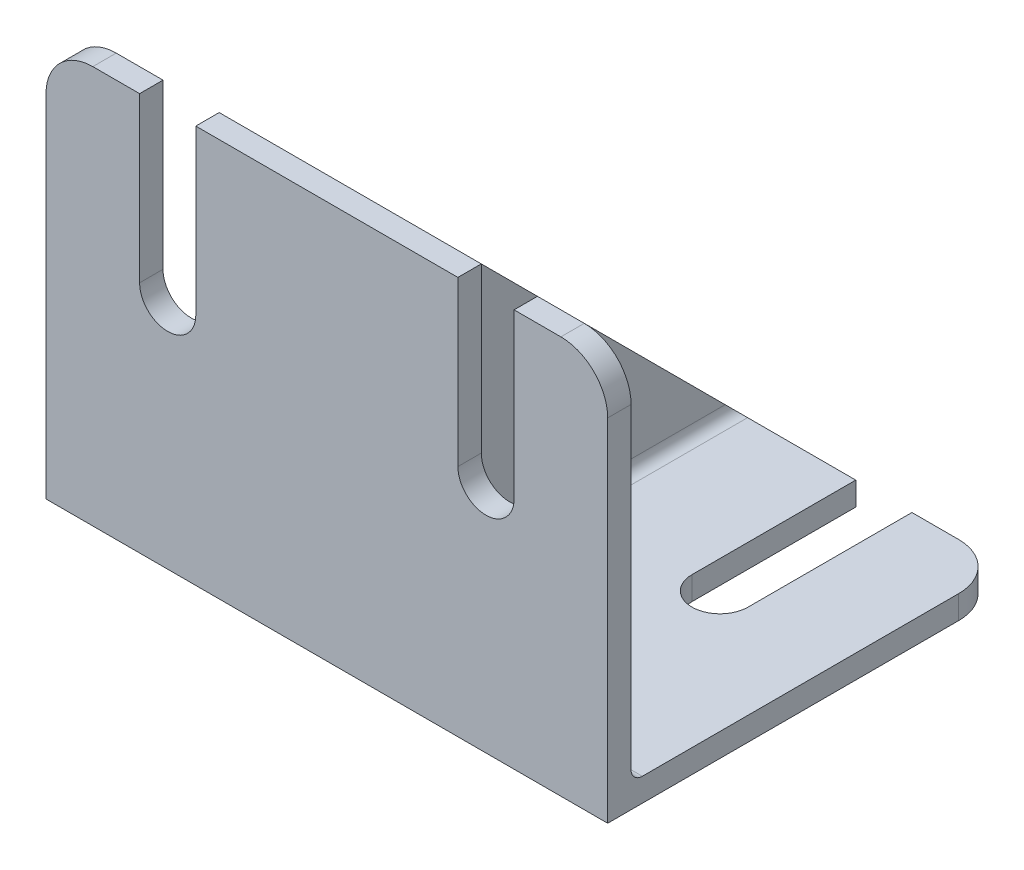
ISO-10303-21;
HEADER;
FILE_DESCRIPTION(('STEP AP214'),'2;1');
FILE_NAME('part.step','',(''),(''),'','','');
FILE_SCHEMA(('AUTOMOTIVE_DESIGN { 1 0 10303 214 1 1 1 1 }'));
ENDSEC;
DATA;
#1=APPLICATION_CONTEXT('core data for automotive mechanical design processes');
#2=APPLICATION_PROTOCOL_DEFINITION('international standard','automotive_design',2000,#1);
#3=PRODUCT_CONTEXT('',#1,'mechanical');
#4=PRODUCT('Part','Part','',(#3));
#5=PRODUCT_RELATED_PRODUCT_CATEGORY('part','',(#4));
#6=PRODUCT_DEFINITION_FORMATION('','',#4);
#7=PRODUCT_DEFINITION_CONTEXT('part definition',#1,'design');
#8=PRODUCT_DEFINITION('design','',#6,#7);
#9=PRODUCT_DEFINITION_SHAPE('','',#8);
#10=(LENGTH_UNIT() NAMED_UNIT(*) SI_UNIT(.MILLI.,.METRE.));
#11=(NAMED_UNIT(*) PLANE_ANGLE_UNIT() SI_UNIT($,.RADIAN.));
#12=(NAMED_UNIT(*) SI_UNIT($,.STERADIAN.) SOLID_ANGLE_UNIT());
#13=UNCERTAINTY_MEASURE_WITH_UNIT(LENGTH_MEASURE(1.E-05),#10,'distance_accuracy_value','');
#14=(GEOMETRIC_REPRESENTATION_CONTEXT(3) GLOBAL_UNCERTAINTY_ASSIGNED_CONTEXT((#13)) GLOBAL_UNIT_ASSIGNED_CONTEXT((#10,
#11,#12)) REPRESENTATION_CONTEXT('',''));
#15=CARTESIAN_POINT('',(0.,0.,0.));
#16=DIRECTION('',(0.,0.,1.));
#17=DIRECTION('',(1.,0.,0.));
#18=AXIS2_PLACEMENT_3D('',#15,#16,#17);
#19=CARTESIAN_POINT('',(76.2,0.,-50.8));
#20=DIRECTION('',(0.,0.,-1.));
#21=DIRECTION('',(-1.,0.,0.));
#22=AXIS2_PLACEMENT_3D('',#19,#20,#21);
#23=PLANE('',#22);
#24=DIRECTION('',(0.,-1.,0.));
#25=VECTOR('',#24,1.);
#26=CARTESIAN_POINT('',(63.5,0.,-50.8));
#27=LINE('',#26,#25);
#28=CARTESIAN_POINT('',(63.5,0.,-50.8));
#29=VERTEX_POINT('',#28);
#30=CARTESIAN_POINT('',(63.5,-3.175,-50.8));
#31=VERTEX_POINT('',#30);
#32=EDGE_CURVE('E267',#29,#31,#27,.T.);
#33=ORIENTED_EDGE('',*,*,#32,.F.);
#34=DIRECTION('',(-1.,0.,0.));
#35=VECTOR('',#34,1.);
#36=CARTESIAN_POINT('',(76.2,0.,-50.8));
#37=LINE('',#36,#35);
#38=CARTESIAN_POINT('',(69.85,0.,-50.8));
#39=VERTEX_POINT('',#38);
#40=EDGE_CURVE('E388',#39,#29,#37,.T.);
#41=ORIENTED_EDGE('',*,*,#40,.F.);
#42=DIRECTION('',(0.,-1.,0.));
#43=VECTOR('',#42,1.);
#44=CARTESIAN_POINT('',(69.85,-3.175,-50.8));
#45=LINE('',#44,#43);
#46=CARTESIAN_POINT('',(69.85,-3.175,-50.8));
#47=VERTEX_POINT('',#46);
#48=EDGE_CURVE('E442',#39,#47,#45,.T.);
#49=ORIENTED_EDGE('',*,*,#48,.T.);
#50=DIRECTION('',(-1.,0.,0.));
#51=VECTOR('',#50,1.);
#52=CARTESIAN_POINT('',(76.2,-3.175,-50.8));
#53=LINE('',#52,#51);
#54=EDGE_CURVE('E394',#47,#31,#53,.T.);
#55=ORIENTED_EDGE('',*,*,#54,.T.);
#56=EDGE_LOOP('',(#33,#41,#49,#55));
#57=FACE_BOUND('',#56,.T.);
#58=ADVANCED_FACE('F33',(#57),#23,.T.);
#59=DIRECTION('',(0.,1.,0.));
#60=VECTOR('',#59,1.);
#61=CARTESIAN_POINT('',(55.88,0.,-50.8));
#62=LINE('',#61,#60);
#63=CARTESIAN_POINT('',(55.88,-3.175,-50.8));
#64=VERTEX_POINT('',#63);
#65=CARTESIAN_POINT('',(55.88,0.,-50.8));
#66=VERTEX_POINT('',#65);
#67=EDGE_CURVE('E260',#64,#66,#62,.T.);
#68=ORIENTED_EDGE('',*,*,#67,.F.);
#69=CARTESIAN_POINT('',(20.32,-3.175,-50.8));
#70=VERTEX_POINT('',#69);
#71=EDGE_CURVE('E397',#64,#70,#53,.T.);
#72=ORIENTED_EDGE('',*,*,#71,.T.);
#73=DIRECTION('',(0.,-1.,0.));
#74=VECTOR('',#73,1.);
#75=CARTESIAN_POINT('',(20.32,0.,-50.8));
#76=LINE('',#75,#74);
#77=CARTESIAN_POINT('',(20.32,0.,-50.8));
#78=VERTEX_POINT('',#77);
#79=EDGE_CURVE('E459',#78,#70,#76,.T.);
#80=ORIENTED_EDGE('',*,*,#79,.F.);
#81=CARTESIAN_POINT('',(34.9885,0.,-50.8));
#82=VERTEX_POINT('',#81);
#83=EDGE_CURVE('E393',#82,#78,#37,.T.);
#84=ORIENTED_EDGE('',*,*,#83,.F.);
#85=DIRECTION('',(1.,0.,0.));
#86=VECTOR('',#85,1.);
#87=CARTESIAN_POINT('',(36.5125,0.,-50.8));
#88=LINE('',#87,#86);
#89=CARTESIAN_POINT('',(41.2115,0.,-50.8));
#90=VERTEX_POINT('',#89);
#91=EDGE_CURVE('E359',#82,#90,#88,.T.);
#92=ORIENTED_EDGE('',*,*,#91,.T.);
#93=EDGE_CURVE('E392',#66,#90,#37,.T.);
#94=ORIENTED_EDGE('',*,*,#93,.F.);
#95=EDGE_LOOP('',(#68,#72,#80,#84,#92,#94));
#96=FACE_BOUND('',#95,.T.);
#97=ADVANCED_FACE('F549',(#96),#23,.T.);
#98=CARTESIAN_POINT('',(76.2,50.8,3.175));
#99=DIRECTION('',(0.,1.,0.));
#100=DIRECTION('',(0.,0.,1.));
#101=AXIS2_PLACEMENT_3D('',#98,#99,#100);
#102=PLANE('',#101);
#103=DIRECTION('',(-1.,0.,0.));
#104=VECTOR('',#103,1.);
#105=CARTESIAN_POINT('',(76.2,50.8,0.));
#106=LINE('',#105,#104);
#107=CARTESIAN_POINT('',(69.85,50.8,0.));
#108=VERTEX_POINT('',#107);
#109=CARTESIAN_POINT('',(63.5,50.8,0.));
#110=VERTEX_POINT('',#109);
#111=EDGE_CURVE('E406',#108,#110,#106,.T.);
#112=ORIENTED_EDGE('',*,*,#111,.T.);
#113=DIRECTION('',(0.,0.,1.));
#114=VECTOR('',#113,1.);
#115=CARTESIAN_POINT('',(63.5,50.8,3.175));
#116=LINE('',#115,#114);
#117=CARTESIAN_POINT('',(63.5,50.8,3.175));
#118=VERTEX_POINT('',#117);
#119=EDGE_CURVE('E330',#110,#118,#116,.T.);
#120=ORIENTED_EDGE('',*,*,#119,.T.);
#121=DIRECTION('',(-1.,0.,0.));
#122=VECTOR('',#121,1.);
#123=CARTESIAN_POINT('',(76.2,50.8,3.175));
#124=LINE('',#123,#122);
#125=CARTESIAN_POINT('',(69.85,50.8,3.175));
#126=VERTEX_POINT('',#125);
#127=EDGE_CURVE('E401',#126,#118,#124,.T.);
#128=ORIENTED_EDGE('',*,*,#127,.F.);
#129=DIRECTION('',(0.,0.,-1.));
#130=VECTOR('',#129,1.);
#131=CARTESIAN_POINT('',(69.85,50.8,0.));
#132=LINE('',#131,#130);
#133=EDGE_CURVE('E423',#126,#108,#132,.T.);
#134=ORIENTED_EDGE('',*,*,#133,.T.);
#135=EDGE_LOOP('',(#112,#120,#128,#134));
#136=FACE_BOUND('',#135,.T.);
#137=ADVANCED_FACE('F628',(#136),#102,.T.);
#138=CARTESIAN_POINT('',(55.88,50.8,3.175));
#139=VERTEX_POINT('',#138);
#140=CARTESIAN_POINT('',(20.32,50.8,3.175));
#141=VERTEX_POINT('',#140);
#142=EDGE_CURVE('E405',#139,#141,#124,.T.);
#143=ORIENTED_EDGE('',*,*,#142,.F.);
#144=DIRECTION('',(0.,0.,-1.));
#145=VECTOR('',#144,1.);
#146=CARTESIAN_POINT('',(55.88,50.8,3.175));
#147=LINE('',#146,#145);
#148=CARTESIAN_POINT('',(55.88,50.8,0.));
#149=VERTEX_POINT('',#148);
#150=EDGE_CURVE('E327',#139,#149,#147,.T.);
#151=ORIENTED_EDGE('',*,*,#150,.T.);
#152=CARTESIAN_POINT('',(41.2115,50.8,0.));
#153=VERTEX_POINT('',#152);
#154=EDGE_CURVE('E410',#149,#153,#106,.T.);
#155=ORIENTED_EDGE('',*,*,#154,.T.);
#156=DIRECTION('',(-1.,0.,0.));
#157=VECTOR('',#156,1.);
#158=CARTESIAN_POINT('',(36.5125,50.8,0.));
#159=LINE('',#158,#157);
#160=CARTESIAN_POINT('',(34.9885,50.8,0.));
#161=VERTEX_POINT('',#160);
#162=EDGE_CURVE('E51',#153,#161,#159,.T.);
#163=ORIENTED_EDGE('',*,*,#162,.T.);
#164=CARTESIAN_POINT('',(20.32,50.8,0.));
#165=VERTEX_POINT('',#164);
#166=EDGE_CURVE('E411',#161,#165,#106,.T.);
#167=ORIENTED_EDGE('',*,*,#166,.T.);
#168=DIRECTION('',(0.,0.,1.));
#169=VECTOR('',#168,1.);
#170=CARTESIAN_POINT('',(20.32,50.8,3.175));
#171=LINE('',#170,#169);
#172=EDGE_CURVE('E355',#165,#141,#171,.T.);
#173=ORIENTED_EDGE('',*,*,#172,.T.);
#174=EDGE_LOOP('',(#143,#151,#155,#163,#167,#173));
#175=FACE_BOUND('',#174,.T.);
#176=ADVANCED_FACE('F584',(#175),#102,.T.);
#177=CARTESIAN_POINT('',(76.2,0.,3.175));
#178=DIRECTION('',(0.,0.,1.));
#179=DIRECTION('',(1.,0.,0.));
#180=AXIS2_PLACEMENT_3D('',#177,#178,#179);
#181=PLANE('',#180);
#182=ORIENTED_EDGE('',*,*,#127,.T.);
#183=DIRECTION('',(0.,1.,0.));
#184=VECTOR('',#183,1.);
#185=CARTESIAN_POINT('',(63.5,28.575,3.175));
#186=LINE('',#185,#184);
#187=CARTESIAN_POINT('',(63.5,28.575,3.175));
#188=VERTEX_POINT('',#187);
#189=EDGE_CURVE('E312',#188,#118,#186,.T.);
#190=ORIENTED_EDGE('',*,*,#189,.F.);
#191=CARTESIAN_POINT('',(59.69,28.575,3.175));
#192=DIRECTION('',(0.,0.,1.));
#193=DIRECTION('',(-1.,0.,0.));
#194=AXIS2_PLACEMENT_3D('',#191,#192,#193);
#195=CIRCLE('',#194,3.81);
#196=CARTESIAN_POINT('',(55.88,28.575,3.175));
#197=VERTEX_POINT('',#196);
#198=EDGE_CURVE('E310',#197,#188,#195,.T.);
#199=ORIENTED_EDGE('',*,*,#198,.F.);
#200=DIRECTION('',(0.,-1.,0.));
#201=VECTOR('',#200,1.);
#202=CARTESIAN_POINT('',(55.88,28.575,3.175));
#203=LINE('',#202,#201);
#204=EDGE_CURVE('E315',#139,#197,#203,.T.);
#205=ORIENTED_EDGE('',*,*,#204,.F.);
#206=ORIENTED_EDGE('',*,*,#142,.T.);
#207=DIRECTION('',(0.,1.,0.));
#208=VECTOR('',#207,1.);
#209=CARTESIAN_POINT('',(20.32,28.575,3.175));
#210=LINE('',#209,#208);
#211=CARTESIAN_POINT('',(20.32,28.575,3.175));
#212=VERTEX_POINT('',#211);
#213=EDGE_CURVE('E336',#212,#141,#210,.T.);
#214=ORIENTED_EDGE('',*,*,#213,.F.);
#215=CARTESIAN_POINT('',(16.51,28.575,3.175));
#216=DIRECTION('',(0.,0.,1.));
#217=DIRECTION('',(1.,0.,0.));
#218=AXIS2_PLACEMENT_3D('',#215,#216,#217);
#219=CIRCLE('',#218,3.81);
#220=CARTESIAN_POINT('',(12.7,28.575,3.175));
#221=VERTEX_POINT('',#220);
#222=EDGE_CURVE('E334',#221,#212,#219,.T.);
#223=ORIENTED_EDGE('',*,*,#222,.F.);
#224=DIRECTION('',(0.,1.,0.));
#225=VECTOR('',#224,1.);
#226=CARTESIAN_POINT('',(12.7,0.,3.175));
#227=LINE('',#226,#225);
#228=CARTESIAN_POINT('',(12.7,50.8,3.175));
#229=VERTEX_POINT('',#228);
#230=EDGE_CURVE('E452',#221,#229,#227,.T.);
#231=ORIENTED_EDGE('',*,*,#230,.T.);
#232=CARTESIAN_POINT('',(6.35000000000002,50.8,3.175));
#233=VERTEX_POINT('',#232);
#234=EDGE_CURVE('E400',#229,#233,#124,.T.);
#235=ORIENTED_EDGE('',*,*,#234,.T.);
#236=CARTESIAN_POINT('',(6.35,44.45,3.175));
#237=DIRECTION('',(0.,0.,1.));
#238=DIRECTION('',(1.,0.,0.));
#239=AXIS2_PLACEMENT_3D('',#236,#237,#238);
#240=CIRCLE('',#239,6.35);
#241=CARTESIAN_POINT('',(0.,44.45,3.175));
#242=VERTEX_POINT('',#241);
#243=EDGE_CURVE('E431',#233,#242,#240,.T.);
#244=ORIENTED_EDGE('',*,*,#243,.T.);
#245=DIRECTION('',(0.,1.,0.));
#246=VECTOR('',#245,1.);
#247=CARTESIAN_POINT('',(0.,0.,3.175));
#248=LINE('',#247,#246);
#249=CARTESIAN_POINT('',(0.,-3.175,3.175));
#250=VERTEX_POINT('',#249);
#251=EDGE_CURVE('E381',#250,#242,#248,.T.);
#252=ORIENTED_EDGE('',*,*,#251,.F.);
#253=DIRECTION('',(-1.,0.,0.));
#254=VECTOR('',#253,1.);
#255=CARTESIAN_POINT('',(76.2,-3.175,3.175));
#256=LINE('',#255,#254);
#257=CARTESIAN_POINT('',(76.2,-3.175,3.175));
#258=VERTEX_POINT('',#257);
#259=EDGE_CURVE('E396',#258,#250,#256,.T.);
#260=ORIENTED_EDGE('',*,*,#259,.F.);
#261=DIRECTION('',(0.,1.,0.));
#262=VECTOR('',#261,1.);
#263=CARTESIAN_POINT('',(76.2,0.,3.175));
#264=LINE('',#263,#262);
#265=CARTESIAN_POINT('',(76.2,44.45,3.175));
#266=VERTEX_POINT('',#265);
#267=EDGE_CURVE('E370',#258,#266,#264,.T.);
#268=ORIENTED_EDGE('',*,*,#267,.T.);
#269=CARTESIAN_POINT('',(69.85,44.45,3.175));
#270=DIRECTION('',(0.,0.,1.));
#271=DIRECTION('',(1.,0.,0.));
#272=AXIS2_PLACEMENT_3D('',#269,#270,#271);
#273=CIRCLE('',#272,6.35);
#274=EDGE_CURVE('E429',#266,#126,#273,.T.);
#275=ORIENTED_EDGE('',*,*,#274,.T.);
#276=EDGE_LOOP('',(#182,#190,#199,#205,#206,#214,#223,#231,#235,#244,#252,#260,#268,#275));
#277=FACE_BOUND('',#276,.T.);
#278=ADVANCED_FACE('F573',(#277),#181,.T.);
#279=CARTESIAN_POINT('',(76.2,0.,0.));
#280=DIRECTION('',(0.,0.,1.));
#281=DIRECTION('',(1.,0.,0.));
#282=AXIS2_PLACEMENT_3D('',#279,#280,#281);
#283=PLANE('',#282);
#284=DIRECTION('',(-1.,0.,0.));
#285=VECTOR('',#284,1.);
#286=CARTESIAN_POINT('',(39.6875,1.524,0.));
#287=LINE('',#286,#285);
#288=CARTESIAN_POINT('',(76.2,1.524,0.));
#289=VERTEX_POINT('',#288);
#290=CARTESIAN_POINT('',(41.2115,1.524,0.));
#291=VERTEX_POINT('',#290);
#292=EDGE_CURVE('E463',#289,#291,#287,.T.);
#293=ORIENTED_EDGE('',*,*,#292,.T.);
#294=DIRECTION('',(0.,1.,0.));
#295=VECTOR('',#294,1.);
#296=CARTESIAN_POINT('',(41.2115,50.8,0.));
#297=LINE('',#296,#295);
#298=EDGE_CURVE('E465',#291,#153,#297,.T.);
#299=ORIENTED_EDGE('',*,*,#298,.T.);
#300=ORIENTED_EDGE('',*,*,#154,.F.);
#301=DIRECTION('',(0.,1.,0.));
#302=VECTOR('',#301,1.);
#303=CARTESIAN_POINT('',(55.88,0.,0.));
#304=LINE('',#303,#302);
#305=CARTESIAN_POINT('',(55.88,28.575,0.));
#306=VERTEX_POINT('',#305);
#307=EDGE_CURVE('E455',#306,#149,#304,.T.);
#308=ORIENTED_EDGE('',*,*,#307,.F.);
#309=CARTESIAN_POINT('',(59.69,28.575,0.));
#310=DIRECTION('',(0.,0.,1.));
#311=DIRECTION('',(-1.,0.,0.));
#312=AXIS2_PLACEMENT_3D('',#309,#310,#311);
#313=CIRCLE('',#312,3.81);
#314=CARTESIAN_POINT('',(63.5,28.575,0.));
#315=VERTEX_POINT('',#314);
#316=EDGE_CURVE('E307',#306,#315,#313,.T.);
#317=ORIENTED_EDGE('',*,*,#316,.T.);
#318=DIRECTION('',(0.,1.,0.));
#319=VECTOR('',#318,1.);
#320=CARTESIAN_POINT('',(63.5,28.575,0.));
#321=LINE('',#320,#319);
#322=EDGE_CURVE('E313',#315,#110,#321,.T.);
#323=ORIENTED_EDGE('',*,*,#322,.T.);
#324=ORIENTED_EDGE('',*,*,#111,.F.);
#325=CARTESIAN_POINT('',(69.85,44.45,0.));
#326=DIRECTION('',(0.,0.,1.));
#327=DIRECTION('',(1.,0.,0.));
#328=AXIS2_PLACEMENT_3D('',#325,#326,#327);
#329=CIRCLE('',#328,6.35);
#330=CARTESIAN_POINT('',(76.2,44.45,0.));
#331=VERTEX_POINT('',#330);
#332=EDGE_CURVE('E417',#108,#331,#329,.F.);
#333=ORIENTED_EDGE('',*,*,#332,.T.);
#334=DIRECTION('',(0.,1.,0.));
#335=VECTOR('',#334,1.);
#336=CARTESIAN_POINT('',(76.2,0.,0.));
#337=LINE('',#336,#335);
#338=EDGE_CURVE('E368',#289,#331,#337,.T.);
#339=ORIENTED_EDGE('',*,*,#338,.F.);
#340=EDGE_LOOP('',(#293,#299,#300,#308,#317,#323,#324,#333,#339));
#341=FACE_BOUND('',#340,.T.);
#342=ADVANCED_FACE('F587',(#341),#283,.F.);
#343=ORIENTED_EDGE('',*,*,#166,.F.);
#344=DIRECTION('',(0.,-1.,0.));
#345=VECTOR('',#344,1.);
#346=CARTESIAN_POINT('',(34.9885,0.,0.));
#347=LINE('',#346,#345);
#348=CARTESIAN_POINT('',(34.9885,1.524,0.));
#349=VERTEX_POINT('',#348);
#350=EDGE_CURVE('E478',#161,#349,#347,.T.);
#351=ORIENTED_EDGE('',*,*,#350,.T.);
#352=DIRECTION('',(-1.,0.,0.));
#353=VECTOR('',#352,1.);
#354=CARTESIAN_POINT('',(0.,1.524,0.));
#355=LINE('',#354,#353);
#356=CARTESIAN_POINT('',(0.,1.524,0.));
#357=VERTEX_POINT('',#356);
#358=EDGE_CURVE('E476',#349,#357,#355,.T.);
#359=ORIENTED_EDGE('',*,*,#358,.T.);
#360=DIRECTION('',(0.,1.,0.));
#361=VECTOR('',#360,1.);
#362=CARTESIAN_POINT('',(0.,0.,0.));
#363=LINE('',#362,#361);
#364=CARTESIAN_POINT('',(0.,44.45,0.));
#365=VERTEX_POINT('',#364);
#366=EDGE_CURVE('E365',#357,#365,#363,.T.);
#367=ORIENTED_EDGE('',*,*,#366,.T.);
#368=CARTESIAN_POINT('',(6.35,44.45,0.));
#369=DIRECTION('',(0.,0.,1.));
#370=DIRECTION('',(1.,0.,0.));
#371=AXIS2_PLACEMENT_3D('',#368,#369,#370);
#372=CIRCLE('',#371,6.35);
#373=CARTESIAN_POINT('',(6.35000000000002,50.8,0.));
#374=VERTEX_POINT('',#373);
#375=EDGE_CURVE('E420',#365,#374,#372,.F.);
#376=ORIENTED_EDGE('',*,*,#375,.T.);
#377=CARTESIAN_POINT('',(12.7,50.8,0.));
#378=VERTEX_POINT('',#377);
#379=EDGE_CURVE('E404',#378,#374,#106,.T.);
#380=ORIENTED_EDGE('',*,*,#379,.F.);
#381=DIRECTION('',(0.,-1.,0.));
#382=VECTOR('',#381,1.);
#383=CARTESIAN_POINT('',(12.7,28.575,0.));
#384=LINE('',#383,#382);
#385=CARTESIAN_POINT('',(12.7,28.575,0.));
#386=VERTEX_POINT('',#385);
#387=EDGE_CURVE('E337',#378,#386,#384,.T.);
#388=ORIENTED_EDGE('',*,*,#387,.T.);
#389=CARTESIAN_POINT('',(16.51,28.575,0.));
#390=DIRECTION('',(0.,0.,1.));
#391=DIRECTION('',(1.,0.,0.));
#392=AXIS2_PLACEMENT_3D('',#389,#390,#391);
#393=CIRCLE('',#392,3.81);
#394=CARTESIAN_POINT('',(20.32,28.575,0.));
#395=VERTEX_POINT('',#394);
#396=EDGE_CURVE('E333',#386,#395,#393,.T.);
#397=ORIENTED_EDGE('',*,*,#396,.T.);
#398=DIRECTION('',(0.,1.,0.));
#399=VECTOR('',#398,1.);
#400=CARTESIAN_POINT('',(20.32,28.575,0.));
#401=LINE('',#400,#399);
#402=EDGE_CURVE('E343',#395,#165,#401,.T.);
#403=ORIENTED_EDGE('',*,*,#402,.T.);
#404=EDGE_LOOP('',(#343,#351,#359,#367,#376,#380,#388,#397,#403));
#405=FACE_BOUND('',#404,.T.);
#406=ADVANCED_FACE('F525',(#405),#283,.F.);
#407=ORIENTED_EDGE('',*,*,#234,.F.);
#408=DIRECTION('',(0.,0.,-1.));
#409=VECTOR('',#408,1.);
#410=CARTESIAN_POINT('',(12.7,50.8,3.175));
#411=LINE('',#410,#409);
#412=EDGE_CURVE('E352',#229,#378,#411,.T.);
#413=ORIENTED_EDGE('',*,*,#412,.T.);
#414=ORIENTED_EDGE('',*,*,#379,.T.);
#415=DIRECTION('',(0.,0.,-1.));
#416=VECTOR('',#415,1.);
#417=CARTESIAN_POINT('',(6.34999999999999,50.8,3.175));
#418=LINE('',#417,#416);
#419=EDGE_CURVE('E426',#374,#233,#418,.F.);
#420=ORIENTED_EDGE('',*,*,#419,.T.);
#421=EDGE_LOOP('',(#407,#413,#414,#420));
#422=FACE_BOUND('',#421,.T.);
#423=ADVANCED_FACE('F646',(#422),#102,.T.);
#424=CARTESIAN_POINT('',(76.2,0.,-50.8));
#425=DIRECTION('',(0.,-1.,0.));
#426=DIRECTION('',(0.,0.,-1.));
#427=AXIS2_PLACEMENT_3D('',#424,#425,#426);
#428=PLANE('',#427);
#429=DIRECTION('',(-1.,0.,0.));
#430=VECTOR('',#429,1.);
#431=CARTESIAN_POINT('',(36.5125,0.,-1.524));
#432=LINE('',#431,#430);
#433=CARTESIAN_POINT('',(0.,0.,-1.524));
#434=VERTEX_POINT('',#433);
#435=CARTESIAN_POINT('',(34.9885,0.,-1.524));
#436=VERTEX_POINT('',#435);
#437=EDGE_CURVE('E485',#434,#436,#432,.F.);
#438=ORIENTED_EDGE('',*,*,#437,.T.);
#439=DIRECTION('',(0.,0.,-1.));
#440=VECTOR('',#439,1.);
#441=CARTESIAN_POINT('',(34.9885,0.,-50.8));
#442=LINE('',#441,#440);
#443=EDGE_CURVE('E487',#436,#82,#442,.T.);
#444=ORIENTED_EDGE('',*,*,#443,.T.);
#445=ORIENTED_EDGE('',*,*,#83,.T.);
#446=DIRECTION('',(0.,0.,-1.));
#447=VECTOR('',#446,1.);
#448=CARTESIAN_POINT('',(20.32,0.,-73.025));
#449=LINE('',#448,#447);
#450=CARTESIAN_POINT('',(20.32,0.,-28.575));
#451=VERTEX_POINT('',#450);
#452=EDGE_CURVE('E292',#451,#78,#449,.T.);
#453=ORIENTED_EDGE('',*,*,#452,.F.);
#454=CARTESIAN_POINT('',(16.51,0.,-28.575));
#455=DIRECTION('',(0.,1.,0.));
#456=DIRECTION('',(0.,0.,1.));
#457=AXIS2_PLACEMENT_3D('',#454,#455,#456);
#458=CIRCLE('',#457,3.81);
#459=CARTESIAN_POINT('',(12.7,0.,-28.575));
#460=VERTEX_POINT('',#459);
#461=EDGE_CURVE('E300',#460,#451,#458,.T.);
#462=ORIENTED_EDGE('',*,*,#461,.F.);
#463=DIRECTION('',(0.,0.,1.));
#464=VECTOR('',#463,1.);
#465=CARTESIAN_POINT('',(12.7,0.,-73.025));
#466=LINE('',#465,#464);
#467=CARTESIAN_POINT('',(12.7,0.,-50.8));
#468=VERTEX_POINT('',#467);
#469=EDGE_CURVE('E287',#468,#460,#466,.T.);
#470=ORIENTED_EDGE('',*,*,#469,.F.);
#471=CARTESIAN_POINT('',(6.35000000000002,0.,-50.8));
#472=VERTEX_POINT('',#471);
#473=EDGE_CURVE('E379',#468,#472,#37,.T.);
#474=ORIENTED_EDGE('',*,*,#473,.T.);
#475=CARTESIAN_POINT('',(6.35,0.,-44.45));
#476=DIRECTION('',(0.,-1.,0.));
#477=DIRECTION('',(0.,0.,-1.));
#478=AXIS2_PLACEMENT_3D('',#475,#476,#477);
#479=CIRCLE('',#478,6.35);
#480=CARTESIAN_POINT('',(0.,0.,-44.45));
#481=VERTEX_POINT('',#480);
#482=EDGE_CURVE('E450',#472,#481,#479,.F.);
#483=ORIENTED_EDGE('',*,*,#482,.T.);
#484=DIRECTION('',(0.,0.,1.));
#485=VECTOR('',#484,1.);
#486=CARTESIAN_POINT('',(0.,0.,-50.8));
#487=LINE('',#486,#485);
#488=EDGE_CURVE('E371',#481,#434,#487,.T.);
#489=ORIENTED_EDGE('',*,*,#488,.T.);
#490=EDGE_LOOP('',(#438,#444,#445,#453,#462,#470,#474,#483,#489));
#491=FACE_BOUND('',#490,.T.);
#492=ADVANCED_FACE('F544',(#491),#428,.F.);
#493=DIRECTION('',(0.,0.,1.));
#494=VECTOR('',#493,1.);
#495=CARTESIAN_POINT('',(41.2115,0.,0.));
#496=LINE('',#495,#494);
#497=CARTESIAN_POINT('',(41.2115,0.,-1.524));
#498=VERTEX_POINT('',#497);
#499=EDGE_CURVE('E472',#90,#498,#496,.T.);
#500=ORIENTED_EDGE('',*,*,#499,.T.);
#501=DIRECTION('',(-1.,0.,0.));
#502=VECTOR('',#501,1.);
#503=CARTESIAN_POINT('',(76.2,0.,-1.524));
#504=LINE('',#503,#502);
#505=CARTESIAN_POINT('',(76.2,0.,-1.524));
#506=VERTEX_POINT('',#505);
#507=EDGE_CURVE('E474',#498,#506,#504,.F.);
#508=ORIENTED_EDGE('',*,*,#507,.T.);
#509=DIRECTION('',(0.,0.,1.));
#510=VECTOR('',#509,1.);
#511=CARTESIAN_POINT('',(76.2,0.,-50.8));
#512=LINE('',#511,#510);
#513=CARTESIAN_POINT('',(76.2,0.,-44.45));
#514=VERTEX_POINT('',#513);
#515=EDGE_CURVE('E376',#514,#506,#512,.T.);
#516=ORIENTED_EDGE('',*,*,#515,.F.);
#517=CARTESIAN_POINT('',(69.85,0.,-44.45));
#518=DIRECTION('',(0.,-1.,0.));
#519=DIRECTION('',(0.,0.,-1.));
#520=AXIS2_PLACEMENT_3D('',#517,#518,#519);
#521=CIRCLE('',#520,6.35);
#522=EDGE_CURVE('E448',#514,#39,#521,.F.);
#523=ORIENTED_EDGE('',*,*,#522,.T.);
#524=ORIENTED_EDGE('',*,*,#40,.T.);
#525=DIRECTION('',(0.,0.,-1.));
#526=VECTOR('',#525,1.);
#527=CARTESIAN_POINT('',(63.5,0.,-73.025));
#528=LINE('',#527,#526);
#529=CARTESIAN_POINT('',(63.5000000000001,0.,-28.575));
#530=VERTEX_POINT('',#529);
#531=EDGE_CURVE('E276',#530,#29,#528,.T.);
#532=ORIENTED_EDGE('',*,*,#531,.F.);
#533=CARTESIAN_POINT('',(59.69,0.,-28.575));
#534=DIRECTION('',(0.,1.,0.));
#535=DIRECTION('',(0.,0.,-1.));
#536=AXIS2_PLACEMENT_3D('',#533,#534,#535);
#537=CIRCLE('',#536,3.81);
#538=CARTESIAN_POINT('',(55.88,0.,-28.575));
#539=VERTEX_POINT('',#538);
#540=EDGE_CURVE('E257',#539,#530,#537,.T.);
#541=ORIENTED_EDGE('',*,*,#540,.F.);
#542=DIRECTION('',(0.,0.,1.));
#543=VECTOR('',#542,1.);
#544=CARTESIAN_POINT('',(55.88,0.,-73.025));
#545=LINE('',#544,#543);
#546=EDGE_CURVE('E280',#66,#539,#545,.T.);
#547=ORIENTED_EDGE('',*,*,#546,.F.);
#548=ORIENTED_EDGE('',*,*,#93,.T.);
#549=EDGE_LOOP('',(#500,#508,#516,#523,#524,#532,#541,#547,#548));
#550=FACE_BOUND('',#549,.T.);
#551=ADVANCED_FACE('F613',(#550),#428,.F.);
#552=CARTESIAN_POINT('',(76.2,-3.175,-50.8));
#553=DIRECTION('',(0.,-1.,0.));
#554=DIRECTION('',(0.,0.,-1.));
#555=AXIS2_PLACEMENT_3D('',#552,#553,#554);
#556=PLANE('',#555);
#557=DIRECTION('',(0.,0.,-1.));
#558=VECTOR('',#557,1.);
#559=CARTESIAN_POINT('',(63.5,-3.175,-73.025));
#560=LINE('',#559,#558);
#561=CARTESIAN_POINT('',(63.5000000000001,-3.175,-28.575));
#562=VERTEX_POINT('',#561);
#563=EDGE_CURVE('E264',#562,#31,#560,.T.);
#564=ORIENTED_EDGE('',*,*,#563,.T.);
#565=ORIENTED_EDGE('',*,*,#54,.F.);
#566=CARTESIAN_POINT('',(69.85,-3.175,-44.45));
#567=DIRECTION('',(0.,-1.,0.));
#568=DIRECTION('',(0.,0.,-1.));
#569=AXIS2_PLACEMENT_3D('',#566,#567,#568);
#570=CIRCLE('',#569,6.35);
#571=CARTESIAN_POINT('',(76.2,-3.175,-44.45));
#572=VERTEX_POINT('',#571);
#573=EDGE_CURVE('E437',#47,#572,#570,.T.);
#574=ORIENTED_EDGE('',*,*,#573,.T.);
#575=DIRECTION('',(0.,0.,1.));
#576=VECTOR('',#575,1.);
#577=CARTESIAN_POINT('',(76.2,-3.175,-50.8));
#578=LINE('',#577,#576);
#579=EDGE_CURVE('E374',#572,#258,#578,.T.);
#580=ORIENTED_EDGE('',*,*,#579,.T.);
#581=ORIENTED_EDGE('',*,*,#259,.T.);
#582=DIRECTION('',(0.,0.,1.));
#583=VECTOR('',#582,1.);
#584=CARTESIAN_POINT('',(0.,-3.175,-50.8));
#585=LINE('',#584,#583);
#586=CARTESIAN_POINT('',(0.,-3.175,-44.45));
#587=VERTEX_POINT('',#586);
#588=EDGE_CURVE('E384',#587,#250,#585,.T.);
#589=ORIENTED_EDGE('',*,*,#588,.F.);
#590=CARTESIAN_POINT('',(6.35,-3.175,-44.45));
#591=DIRECTION('',(0.,-1.,0.));
#592=DIRECTION('',(0.,0.,-1.));
#593=AXIS2_PLACEMENT_3D('',#590,#591,#592);
#594=CIRCLE('',#593,6.35);
#595=CARTESIAN_POINT('',(6.35000000000002,-3.175,-50.8));
#596=VERTEX_POINT('',#595);
#597=EDGE_CURVE('E439',#587,#596,#594,.T.);
#598=ORIENTED_EDGE('',*,*,#597,.T.);
#599=CARTESIAN_POINT('',(12.7,-3.175,-50.8));
#600=VERTEX_POINT('',#599);
#601=EDGE_CURVE('E391',#600,#596,#53,.T.);
#602=ORIENTED_EDGE('',*,*,#601,.F.);
#603=DIRECTION('',(0.,0.,1.));
#604=VECTOR('',#603,1.);
#605=CARTESIAN_POINT('',(12.7,-3.175,-73.025));
#606=LINE('',#605,#604);
#607=CARTESIAN_POINT('',(12.7,-3.175,-28.575));
#608=VERTEX_POINT('',#607);
#609=EDGE_CURVE('E288',#600,#608,#606,.T.);
#610=ORIENTED_EDGE('',*,*,#609,.T.);
#611=CARTESIAN_POINT('',(16.51,-3.175,-28.575));
#612=DIRECTION('',(0.,1.,0.));
#613=DIRECTION('',(0.,0.,1.));
#614=AXIS2_PLACEMENT_3D('',#611,#612,#613);
#615=CIRCLE('',#614,3.81);
#616=CARTESIAN_POINT('',(20.32,-3.175,-28.575));
#617=VERTEX_POINT('',#616);
#618=EDGE_CURVE('E291',#608,#617,#615,.T.);
#619=ORIENTED_EDGE('',*,*,#618,.T.);
#620=DIRECTION('',(0.,0.,-1.));
#621=VECTOR('',#620,1.);
#622=CARTESIAN_POINT('',(20.32,-3.175,-73.025));
#623=LINE('',#622,#621);
#624=EDGE_CURVE('E295',#617,#70,#623,.T.);
#625=ORIENTED_EDGE('',*,*,#624,.T.);
#626=ORIENTED_EDGE('',*,*,#71,.F.);
#627=DIRECTION('',(0.,0.,-1.));
#628=VECTOR('',#627,1.);
#629=CARTESIAN_POINT('',(55.88,-3.175,-50.8));
#630=LINE('',#629,#628);
#631=CARTESIAN_POINT('',(55.88,-3.175,-28.575));
#632=VERTEX_POINT('',#631);
#633=EDGE_CURVE('E275',#632,#64,#630,.T.);
#634=ORIENTED_EDGE('',*,*,#633,.F.);
#635=CARTESIAN_POINT('',(59.69,-3.175,-28.575));
#636=DIRECTION('',(0.,1.,0.));
#637=DIRECTION('',(0.,0.,-1.));
#638=AXIS2_PLACEMENT_3D('',#635,#636,#637);
#639=CIRCLE('',#638,3.81);
#640=EDGE_CURVE('E254',#632,#562,#639,.T.);
#641=ORIENTED_EDGE('',*,*,#640,.T.);
#642=EDGE_LOOP('',(#564,#565,#574,#580,#581,#589,#598,#602,#610,#619,#625,#626,#634,#641));
#643=FACE_BOUND('',#642,.T.);
#644=ADVANCED_FACE('F273',(#643),#556,.T.);
#645=DIRECTION('',(0.,1.,0.));
#646=VECTOR('',#645,1.);
#647=CARTESIAN_POINT('',(12.7,0.,-50.8));
#648=LINE('',#647,#646);
#649=EDGE_CURVE('E457',#600,#468,#648,.T.);
#650=ORIENTED_EDGE('',*,*,#649,.F.);
#651=ORIENTED_EDGE('',*,*,#601,.T.);
#652=DIRECTION('',(0.,-1.,0.));
#653=VECTOR('',#652,1.);
#654=CARTESIAN_POINT('',(6.34999999999999,0.,-50.8));
#655=LINE('',#654,#653);
#656=EDGE_CURVE('E445',#596,#472,#655,.F.);
#657=ORIENTED_EDGE('',*,*,#656,.T.);
#658=ORIENTED_EDGE('',*,*,#473,.F.);
#659=EDGE_LOOP('',(#650,#651,#657,#658));
#660=FACE_BOUND('',#659,.T.);
#661=ADVANCED_FACE('F560',(#660),#23,.T.);
#662=CARTESIAN_POINT('',(76.2,50.8,0.));
#663=DIRECTION('',(-1.,0.,0.));
#664=DIRECTION('',(0.,0.,1.));
#665=AXIS2_PLACEMENT_3D('',#662,#663,#664);
#666=PLANE('',#665);
#667=ORIENTED_EDGE('',*,*,#515,.T.);
#668=CARTESIAN_POINT('',(76.2,1.524,-1.524));
#669=DIRECTION('',(-1.,0.,0.));
#670=DIRECTION('',(0.,0.,1.));
#671=AXIS2_PLACEMENT_3D('',#668,#669,#670);
#672=CIRCLE('',#671,1.524);
#673=EDGE_CURVE('E492',#506,#289,#672,.T.);
#674=ORIENTED_EDGE('',*,*,#673,.T.);
#675=ORIENTED_EDGE('',*,*,#338,.T.);
#676=DIRECTION('',(0.,0.,-1.));
#677=VECTOR('',#676,1.);
#678=CARTESIAN_POINT('',(76.2,44.45,3.175));
#679=LINE('',#678,#677);
#680=EDGE_CURVE('E435',#331,#266,#679,.F.);
#681=ORIENTED_EDGE('',*,*,#680,.T.);
#682=ORIENTED_EDGE('',*,*,#267,.F.);
#683=ORIENTED_EDGE('',*,*,#579,.F.);
#684=DIRECTION('',(0.,-1.,0.));
#685=VECTOR('',#684,1.);
#686=CARTESIAN_POINT('',(76.2,0.,-44.45));
#687=LINE('',#686,#685);
#688=EDGE_CURVE('E433',#572,#514,#687,.F.);
#689=ORIENTED_EDGE('',*,*,#688,.T.);
#690=EDGE_LOOP('',(#667,#674,#675,#681,#682,#683,#689));
#691=FACE_BOUND('',#690,.T.);
#692=ADVANCED_FACE('F616',(#691),#666,.F.);
#693=CARTESIAN_POINT('',(0.,50.8,0.));
#694=DIRECTION('',(-1.,0.,0.));
#695=DIRECTION('',(0.,0.,1.));
#696=AXIS2_PLACEMENT_3D('',#693,#694,#695);
#697=PLANE('',#696);
#698=ORIENTED_EDGE('',*,*,#251,.T.);
#699=DIRECTION('',(0.,0.,-1.));
#700=VECTOR('',#699,1.);
#701=CARTESIAN_POINT('',(0.,44.45,0.));
#702=LINE('',#701,#700);
#703=EDGE_CURVE('E414',#242,#365,#702,.T.);
#704=ORIENTED_EDGE('',*,*,#703,.T.);
#705=ORIENTED_EDGE('',*,*,#366,.F.);
#706=CARTESIAN_POINT('',(0.,1.524,-1.524));
#707=DIRECTION('',(-1.,0.,0.));
#708=DIRECTION('',(0.,0.,1.));
#709=AXIS2_PLACEMENT_3D('',#706,#707,#708);
#710=CIRCLE('',#709,1.524);
#711=EDGE_CURVE('E11',#357,#434,#710,.F.);
#712=ORIENTED_EDGE('',*,*,#711,.T.);
#713=ORIENTED_EDGE('',*,*,#488,.F.);
#714=DIRECTION('',(0.,-1.,0.));
#715=VECTOR('',#714,1.);
#716=CARTESIAN_POINT('',(0.,50.8,-44.45));
#717=LINE('',#716,#715);
#718=EDGE_CURVE('E409',#481,#587,#717,.T.);
#719=ORIENTED_EDGE('',*,*,#718,.T.);
#720=ORIENTED_EDGE('',*,*,#588,.T.);
#721=EDGE_LOOP('',(#698,#704,#705,#712,#713,#719,#720));
#722=FACE_BOUND('',#721,.T.);
#723=ADVANCED_FACE('F567',(#722),#697,.T.);
#724=CARTESIAN_POINT('',(6.35,44.45,0.));
#725=DIRECTION('',(0.,0.,-1.));
#726=DIRECTION('',(-1.,0.,0.));
#727=AXIS2_PLACEMENT_3D('',#724,#725,#726);
#728=CYLINDRICAL_SURFACE('',#727,6.35);
#729=ORIENTED_EDGE('',*,*,#243,.F.);
#730=ORIENTED_EDGE('',*,*,#419,.F.);
#731=ORIENTED_EDGE('',*,*,#375,.F.);
#732=ORIENTED_EDGE('',*,*,#703,.F.);
#733=EDGE_LOOP('',(#729,#730,#731,#732));
#734=FACE_BOUND('',#733,.T.);
#735=ADVANCED_FACE('F578',(#734),#728,.T.);
#736=CARTESIAN_POINT('',(69.85,44.45,3.175));
#737=DIRECTION('',(0.,0.,1.));
#738=DIRECTION('',(1.,0.,0.));
#739=AXIS2_PLACEMENT_3D('',#736,#737,#738);
#740=CYLINDRICAL_SURFACE('',#739,6.35);
#741=ORIENTED_EDGE('',*,*,#274,.F.);
#742=ORIENTED_EDGE('',*,*,#680,.F.);
#743=ORIENTED_EDGE('',*,*,#332,.F.);
#744=ORIENTED_EDGE('',*,*,#133,.F.);
#745=EDGE_LOOP('',(#741,#742,#743,#744));
#746=FACE_BOUND('',#745,.T.);
#747=ADVANCED_FACE('F651',(#746),#740,.T.);
#748=CARTESIAN_POINT('',(6.35,50.8,-44.45));
#749=DIRECTION('',(0.,-1.,0.));
#750=DIRECTION('',(0.,0.,-1.));
#751=AXIS2_PLACEMENT_3D('',#748,#749,#750);
#752=CYLINDRICAL_SURFACE('',#751,6.35);
#753=ORIENTED_EDGE('',*,*,#482,.F.);
#754=ORIENTED_EDGE('',*,*,#656,.F.);
#755=ORIENTED_EDGE('',*,*,#597,.F.);
#756=ORIENTED_EDGE('',*,*,#718,.F.);
#757=EDGE_LOOP('',(#753,#754,#755,#756));
#758=FACE_BOUND('',#757,.T.);
#759=ADVANCED_FACE('F564',(#758),#752,.T.);
#760=CARTESIAN_POINT('',(69.85,0.,-44.45));
#761=DIRECTION('',(0.,1.,0.));
#762=DIRECTION('',(0.,0.,1.));
#763=AXIS2_PLACEMENT_3D('',#760,#761,#762);
#764=CYLINDRICAL_SURFACE('',#763,6.35);
#765=ORIENTED_EDGE('',*,*,#522,.F.);
#766=ORIENTED_EDGE('',*,*,#688,.F.);
#767=ORIENTED_EDGE('',*,*,#573,.F.);
#768=ORIENTED_EDGE('',*,*,#48,.F.);
#769=EDGE_LOOP('',(#765,#766,#767,#768));
#770=FACE_BOUND('',#769,.T.);
#771=ADVANCED_FACE('F619',(#770),#764,.T.);
#772=CARTESIAN_POINT('',(36.5125,-500000.,499949.2));
#773=DIRECTION('',(1.,0.,0.));
#774=DIRECTION('',(0.,0.,-1.));
#775=AXIS2_PLACEMENT_3D('',#772,#773,#774);
#776=PLANE('',#775);
#777=DIRECTION('',(0.,0.,-1.));
#778=VECTOR('',#777,1.);
#779=CARTESIAN_POINT('',(36.5125,1.524,0.));
#780=LINE('',#779,#778);
#781=CARTESIAN_POINT('',(36.5125,1.524,-49.276));
#782=VERTEX_POINT('',#781);
#783=CARTESIAN_POINT('',(36.5125,1.524,-1.524));
#784=VERTEX_POINT('',#783);
#785=EDGE_CURVE('E481',#782,#784,#780,.F.);
#786=ORIENTED_EDGE('',*,*,#785,.T.);
#787=DIRECTION('',(0.,-1.,0.));
#788=VECTOR('',#787,1.);
#789=CARTESIAN_POINT('',(36.5125,50.8,-1.524));
#790=LINE('',#789,#788);
#791=CARTESIAN_POINT('',(36.5125,49.276,-1.524));
#792=VERTEX_POINT('',#791);
#793=EDGE_CURVE('E483',#784,#792,#790,.F.);
#794=ORIENTED_EDGE('',*,*,#793,.T.);
#795=DIRECTION('',(0.,-0.707106781186547,-0.707106781186548));
#796=VECTOR('',#795,1.);
#797=CARTESIAN_POINT('',(36.5125,0.,-50.8));
#798=LINE('',#797,#796);
#799=EDGE_CURVE('E361',#792,#782,#798,.T.);
#800=ORIENTED_EDGE('',*,*,#799,.T.);
#801=EDGE_LOOP('',(#786,#794,#800));
#802=FACE_BOUND('',#801,.T.);
#803=ADVANCED_FACE('F532',(#802),#776,.F.);
#804=CARTESIAN_POINT('',(39.6875,-500000.,499949.2));
#805=DIRECTION('',(-1.,0.,0.));
#806=DIRECTION('',(0.,0.,1.));
#807=AXIS2_PLACEMENT_3D('',#804,#805,#806);
#808=PLANE('',#807);
#809=DIRECTION('',(0.,0.707106781186547,0.707106781186548));
#810=VECTOR('',#809,1.);
#811=CARTESIAN_POINT('',(39.6875,0.,-50.8));
#812=LINE('',#811,#810);
#813=CARTESIAN_POINT('',(39.6875,1.524,-49.276));
#814=VERTEX_POINT('',#813);
#815=CARTESIAN_POINT('',(39.6875,49.276,-1.524));
#816=VERTEX_POINT('',#815);
#817=EDGE_CURVE('E358',#814,#816,#812,.T.);
#818=ORIENTED_EDGE('',*,*,#817,.T.);
#819=DIRECTION('',(0.,1.,0.));
#820=VECTOR('',#819,1.);
#821=CARTESIAN_POINT('',(39.6875,0.,-1.524));
#822=LINE('',#821,#820);
#823=CARTESIAN_POINT('',(39.6875,1.524,-1.524));
#824=VERTEX_POINT('',#823);
#825=EDGE_CURVE('E470',#816,#824,#822,.F.);
#826=ORIENTED_EDGE('',*,*,#825,.T.);
#827=DIRECTION('',(0.,0.,1.));
#828=VECTOR('',#827,1.);
#829=CARTESIAN_POINT('',(39.6875,1.524,-50.8));
#830=LINE('',#829,#828);
#831=EDGE_CURVE('E468',#824,#814,#830,.F.);
#832=ORIENTED_EDGE('',*,*,#831,.T.);
#833=EDGE_LOOP('',(#818,#826,#832));
#834=FACE_BOUND('',#833,.T.);
#835=ADVANCED_FACE('F599',(#834),#808,.F.);
#836=CARTESIAN_POINT('',(39.6875,50.8,0.));
#837=DIRECTION('',(0.,0.707106781186548,-0.707106781186547));
#838=DIRECTION('',(0.,0.707106781186547,0.707106781186548));
#839=AXIS2_PLACEMENT_3D('',#836,#837,#838);
#840=PLANE('',#839);
#841=ORIENTED_EDGE('',*,*,#817,.F.);
#842=CARTESIAN_POINT('',(41.2115,1.524,-49.276));
#843=DIRECTION('',(0.,0.707106781186548,-0.707106781186547));
#844=DIRECTION('',(0.,-0.707106781186547,-0.707106781186548));
#845=AXIS2_PLACEMENT_3D('',#842,#843,#844);
#846=ELLIPSE('',#845,2.1552614690566,1.524);
#847=EDGE_CURVE('E494',#814,#90,#846,.F.);
#848=ORIENTED_EDGE('',*,*,#847,.T.);
#849=ORIENTED_EDGE('',*,*,#91,.F.);
#850=CARTESIAN_POINT('',(34.9885,1.524,-49.276));
#851=DIRECTION('',(0.,0.707106781186548,-0.707106781186547));
#852=DIRECTION('',(0.,0.707106781186547,0.707106781186548));
#853=AXIS2_PLACEMENT_3D('',#850,#851,#852);
#854=ELLIPSE('',#853,2.1552614690566,1.524);
#855=EDGE_CURVE('E43',#82,#782,#854,.F.);
#856=ORIENTED_EDGE('',*,*,#855,.T.);
#857=ORIENTED_EDGE('',*,*,#799,.F.);
#858=CARTESIAN_POINT('',(34.9885,49.276,-1.524));
#859=DIRECTION('',(0.,0.707106781186548,-0.707106781186547));
#860=DIRECTION('',(0.,0.707106781186547,0.707106781186548));
#861=AXIS2_PLACEMENT_3D('',#858,#859,#860);
#862=ELLIPSE('',#861,2.1552614690566,1.524);
#863=EDGE_CURVE('E497',#792,#161,#862,.F.);
#864=ORIENTED_EDGE('',*,*,#863,.T.);
#865=ORIENTED_EDGE('',*,*,#162,.F.);
#866=CARTESIAN_POINT('',(41.2115,49.276,-1.524));
#867=DIRECTION('',(0.,0.707106781186548,-0.707106781186547));
#868=DIRECTION('',(0.,-0.707106781186547,-0.707106781186548));
#869=AXIS2_PLACEMENT_3D('',#866,#867,#868);
#870=ELLIPSE('',#869,2.1552614690566,1.524);
#871=EDGE_CURVE('E490',#153,#816,#870,.F.);
#872=ORIENTED_EDGE('',*,*,#871,.T.);
#873=EDGE_LOOP('',(#841,#848,#849,#856,#857,#864,#865,#872));
#874=FACE_BOUND('',#873,.T.);
#875=ADVANCED_FACE('F536',(#874),#840,.T.);
#876=CARTESIAN_POINT('',(16.51,28.575,3.175));
#877=DIRECTION('',(0.,0.,-1.));
#878=DIRECTION('',(-1.,0.,0.));
#879=AXIS2_PLACEMENT_3D('',#876,#877,#878);
#880=CYLINDRICAL_SURFACE('',#879,3.81);
#881=ORIENTED_EDGE('',*,*,#396,.F.);
#882=DIRECTION('',(0.,0.,-1.));
#883=VECTOR('',#882,1.);
#884=CARTESIAN_POINT('',(12.7,28.575,3.175));
#885=LINE('',#884,#883);
#886=EDGE_CURVE('E340',#221,#386,#885,.T.);
#887=ORIENTED_EDGE('',*,*,#886,.F.);
#888=ORIENTED_EDGE('',*,*,#222,.T.);
#889=DIRECTION('',(0.,0.,-1.));
#890=VECTOR('',#889,1.);
#891=CARTESIAN_POINT('',(20.32,28.575,3.175));
#892=LINE('',#891,#890);
#893=EDGE_CURVE('E349',#212,#395,#892,.T.);
#894=ORIENTED_EDGE('',*,*,#893,.T.);
#895=EDGE_LOOP('',(#881,#887,#888,#894));
#896=FACE_BOUND('',#895,.T.);
#897=ADVANCED_FACE('F777',(#896),#880,.F.);
#898=CARTESIAN_POINT('',(20.32,28.575,3.175));
#899=DIRECTION('',(-1.,0.,0.));
#900=DIRECTION('',(0.,0.,1.));
#901=AXIS2_PLACEMENT_3D('',#898,#899,#900);
#902=PLANE('',#901);
#903=ORIENTED_EDGE('',*,*,#402,.F.);
#904=ORIENTED_EDGE('',*,*,#893,.F.);
#905=ORIENTED_EDGE('',*,*,#213,.T.);
#906=ORIENTED_EDGE('',*,*,#172,.F.);
#907=EDGE_LOOP('',(#903,#904,#905,#906));
#908=FACE_BOUND('',#907,.T.);
#909=ADVANCED_FACE('F769',(#908),#902,.T.);
#910=CARTESIAN_POINT('',(12.7,28.575,3.175));
#911=DIRECTION('',(1.,0.,0.));
#912=DIRECTION('',(0.,0.,-1.));
#913=AXIS2_PLACEMENT_3D('',#910,#911,#912);
#914=PLANE('',#913);
#915=ORIENTED_EDGE('',*,*,#230,.F.);
#916=ORIENTED_EDGE('',*,*,#886,.T.);
#917=ORIENTED_EDGE('',*,*,#387,.F.);
#918=ORIENTED_EDGE('',*,*,#412,.F.);
#919=EDGE_LOOP('',(#915,#916,#917,#918));
#920=FACE_BOUND('',#919,.T.);
#921=ADVANCED_FACE('F761',(#920),#914,.T.);
#922=CARTESIAN_POINT('',(59.69,28.575,3.175));
#923=DIRECTION('',(0.,0.,-1.));
#924=DIRECTION('',(-1.,0.,0.));
#925=AXIS2_PLACEMENT_3D('',#922,#923,#924);
#926=CYLINDRICAL_SURFACE('',#925,3.81);
#927=ORIENTED_EDGE('',*,*,#316,.F.);
#928=DIRECTION('',(0.,0.,-1.));
#929=VECTOR('',#928,1.);
#930=CARTESIAN_POINT('',(55.88,28.575,3.175));
#931=LINE('',#930,#929);
#932=EDGE_CURVE('E317',#197,#306,#931,.T.);
#933=ORIENTED_EDGE('',*,*,#932,.F.);
#934=ORIENTED_EDGE('',*,*,#198,.T.);
#935=DIRECTION('',(0.,0.,-1.));
#936=VECTOR('',#935,1.);
#937=CARTESIAN_POINT('',(63.5,28.575,3.175));
#938=LINE('',#937,#936);
#939=EDGE_CURVE('E324',#188,#315,#938,.T.);
#940=ORIENTED_EDGE('',*,*,#939,.T.);
#941=EDGE_LOOP('',(#927,#933,#934,#940));
#942=FACE_BOUND('',#941,.T.);
#943=ADVANCED_FACE('F753',(#942),#926,.F.);
#944=CARTESIAN_POINT('',(63.5,28.575,3.175));
#945=DIRECTION('',(-1.,0.,0.));
#946=DIRECTION('',(0.,0.,1.));
#947=AXIS2_PLACEMENT_3D('',#944,#945,#946);
#948=PLANE('',#947);
#949=ORIENTED_EDGE('',*,*,#322,.F.);
#950=ORIENTED_EDGE('',*,*,#939,.F.);
#951=ORIENTED_EDGE('',*,*,#189,.T.);
#952=ORIENTED_EDGE('',*,*,#119,.F.);
#953=EDGE_LOOP('',(#949,#950,#951,#952));
#954=FACE_BOUND('',#953,.T.);
#955=ADVANCED_FACE('F745',(#954),#948,.T.);
#956=CARTESIAN_POINT('',(55.88,28.575,3.175));
#957=DIRECTION('',(1.,0.,0.));
#958=DIRECTION('',(0.,0.,-1.));
#959=AXIS2_PLACEMENT_3D('',#956,#957,#958);
#960=PLANE('',#959);
#961=ORIENTED_EDGE('',*,*,#204,.T.);
#962=ORIENTED_EDGE('',*,*,#932,.T.);
#963=ORIENTED_EDGE('',*,*,#307,.T.);
#964=ORIENTED_EDGE('',*,*,#150,.F.);
#965=EDGE_LOOP('',(#961,#962,#963,#964));
#966=FACE_BOUND('',#965,.T.);
#967=ADVANCED_FACE('F737',(#966),#960,.T.);
#968=CARTESIAN_POINT('',(20.32,-3.175,-73.025));
#969=DIRECTION('',(1.,0.,0.));
#970=DIRECTION('',(0.,0.,-1.));
#971=AXIS2_PLACEMENT_3D('',#968,#969,#970);
#972=PLANE('',#971);
#973=ORIENTED_EDGE('',*,*,#79,.T.);
#974=ORIENTED_EDGE('',*,*,#624,.F.);
#975=DIRECTION('',(0.,1.,0.));
#976=VECTOR('',#975,1.);
#977=CARTESIAN_POINT('',(20.32,-3.175,-28.575));
#978=LINE('',#977,#976);
#979=EDGE_CURVE('E305',#617,#451,#978,.T.);
#980=ORIENTED_EDGE('',*,*,#979,.T.);
#981=ORIENTED_EDGE('',*,*,#452,.T.);
#982=EDGE_LOOP('',(#973,#974,#980,#981));
#983=FACE_BOUND('',#982,.T.);
#984=ADVANCED_FACE('F729',(#983),#972,.F.);
#985=CARTESIAN_POINT('',(16.51,-3.175,-28.575));
#986=DIRECTION('',(0.,1.,0.));
#987=DIRECTION('',(0.,0.,1.));
#988=AXIS2_PLACEMENT_3D('',#985,#986,#987);
#989=CYLINDRICAL_SURFACE('',#988,3.81);
#990=ORIENTED_EDGE('',*,*,#461,.T.);
#991=ORIENTED_EDGE('',*,*,#979,.F.);
#992=ORIENTED_EDGE('',*,*,#618,.F.);
#993=DIRECTION('',(0.,1.,0.));
#994=VECTOR('',#993,1.);
#995=CARTESIAN_POINT('',(12.7,-3.175,-28.575));
#996=LINE('',#995,#994);
#997=EDGE_CURVE('E298',#608,#460,#996,.T.);
#998=ORIENTED_EDGE('',*,*,#997,.T.);
#999=EDGE_LOOP('',(#990,#991,#992,#998));
#1000=FACE_BOUND('',#999,.T.);
#1001=ADVANCED_FACE('F721',(#1000),#989,.F.);
#1002=CARTESIAN_POINT('',(12.7,-3.175,-73.025));
#1003=DIRECTION('',(-1.,0.,0.));
#1004=DIRECTION('',(0.,0.,1.));
#1005=AXIS2_PLACEMENT_3D('',#1002,#1003,#1004);
#1006=PLANE('',#1005);
#1007=ORIENTED_EDGE('',*,*,#649,.T.);
#1008=ORIENTED_EDGE('',*,*,#469,.T.);
#1009=ORIENTED_EDGE('',*,*,#997,.F.);
#1010=ORIENTED_EDGE('',*,*,#609,.F.);
#1011=EDGE_LOOP('',(#1007,#1008,#1009,#1010));
#1012=FACE_BOUND('',#1011,.T.);
#1013=ADVANCED_FACE('F714',(#1012),#1006,.F.);
#1014=CARTESIAN_POINT('',(63.5,-3.175,-73.025));
#1015=DIRECTION('',(1.,0.,0.));
#1016=DIRECTION('',(0.,0.,-1.));
#1017=AXIS2_PLACEMENT_3D('',#1014,#1015,#1016);
#1018=PLANE('',#1017);
#1019=ORIENTED_EDGE('',*,*,#32,.T.);
#1020=ORIENTED_EDGE('',*,*,#563,.F.);
#1021=DIRECTION('',(0.,1.,0.));
#1022=VECTOR('',#1021,1.);
#1023=CARTESIAN_POINT('',(63.5000000000001,-3.175,-28.575));
#1024=LINE('',#1023,#1022);
#1025=EDGE_CURVE('E249',#562,#530,#1024,.T.);
#1026=ORIENTED_EDGE('',*,*,#1025,.T.);
#1027=ORIENTED_EDGE('',*,*,#531,.T.);
#1028=EDGE_LOOP('',(#1019,#1020,#1026,#1027));
#1029=FACE_BOUND('',#1028,.T.);
#1030=ADVANCED_FACE('F265',(#1029),#1018,.F.);
#1031=CARTESIAN_POINT('',(59.69,-3.175,-28.575));
#1032=DIRECTION('',(0.,1.,0.));
#1033=DIRECTION('',(0.,0.,1.));
#1034=AXIS2_PLACEMENT_3D('',#1031,#1032,#1033);
#1035=CYLINDRICAL_SURFACE('',#1034,3.81);
#1036=ORIENTED_EDGE('',*,*,#540,.T.);
#1037=ORIENTED_EDGE('',*,*,#1025,.F.);
#1038=ORIENTED_EDGE('',*,*,#640,.F.);
#1039=DIRECTION('',(0.,1.,0.));
#1040=VECTOR('',#1039,1.);
#1041=CARTESIAN_POINT('',(55.88,-3.175,-28.575));
#1042=LINE('',#1041,#1040);
#1043=EDGE_CURVE('E261',#632,#539,#1042,.T.);
#1044=ORIENTED_EDGE('',*,*,#1043,.T.);
#1045=EDGE_LOOP('',(#1036,#1037,#1038,#1044));
#1046=FACE_BOUND('',#1045,.T.);
#1047=ADVANCED_FACE('F251',(#1046),#1035,.F.);
#1048=CARTESIAN_POINT('',(55.88,-3.175,-73.025));
#1049=DIRECTION('',(-1.,0.,0.));
#1050=DIRECTION('',(0.,0.,1.));
#1051=AXIS2_PLACEMENT_3D('',#1048,#1049,#1050);
#1052=PLANE('',#1051);
#1053=ORIENTED_EDGE('',*,*,#67,.T.);
#1054=ORIENTED_EDGE('',*,*,#546,.T.);
#1055=ORIENTED_EDGE('',*,*,#1043,.F.);
#1056=ORIENTED_EDGE('',*,*,#633,.T.);
#1057=EDGE_LOOP('',(#1053,#1054,#1055,#1056));
#1058=FACE_BOUND('',#1057,.T.);
#1059=ADVANCED_FACE('F667',(#1058),#1052,.F.);
#1060=CARTESIAN_POINT('',(41.2115,1.524,-50.8));
#1061=DIRECTION('',(0.,0.,-1.));
#1062=DIRECTION('',(0.,1.,0.));
#1063=AXIS2_PLACEMENT_3D('',#1060,#1061,#1062);
#1064=CYLINDRICAL_SURFACE('',#1063,1.524);
#1065=ORIENTED_EDGE('',*,*,#847,.F.);
#1066=ORIENTED_EDGE('',*,*,#831,.F.);
#1067=CARTESIAN_POINT('',(41.2115,1.524,-1.524));
#1068=DIRECTION('',(0.,0.,-1.));
#1069=DIRECTION('',(-1.,0.,0.));
#1070=AXIS2_PLACEMENT_3D('',#1067,#1068,#1069);
#1071=CIRCLE('',#1070,1.524);
#1072=EDGE_CURVE('E282',#498,#824,#1071,.T.);
#1073=ORIENTED_EDGE('',*,*,#1072,.F.);
#1074=ORIENTED_EDGE('',*,*,#499,.F.);
#1075=EDGE_LOOP('',(#1065,#1066,#1073,#1074));
#1076=FACE_BOUND('',#1075,.T.);
#1077=ADVANCED_FACE('F603',(#1076),#1064,.F.);
#1078=CARTESIAN_POINT('',(76.2,1.524,-1.524));
#1079=DIRECTION('',(1.,0.,0.));
#1080=DIRECTION('',(0.,0.,-1.));
#1081=AXIS2_PLACEMENT_3D('',#1078,#1079,#1080);
#1082=CYLINDRICAL_SURFACE('',#1081,1.524);
#1083=ORIENTED_EDGE('',*,*,#673,.F.);
#1084=ORIENTED_EDGE('',*,*,#507,.F.);
#1085=CARTESIAN_POINT('',(41.2115,1.524,-1.524));
#1086=DIRECTION('',(1.,0.,0.));
#1087=DIRECTION('',(0.,0.,-1.));
#1088=AXIS2_PLACEMENT_3D('',#1085,#1086,#1087);
#1089=CIRCLE('',#1088,1.524);
#1090=EDGE_CURVE('E504',#291,#498,#1089,.T.);
#1091=ORIENTED_EDGE('',*,*,#1090,.F.);
#1092=ORIENTED_EDGE('',*,*,#292,.F.);
#1093=EDGE_LOOP('',(#1083,#1084,#1091,#1092));
#1094=FACE_BOUND('',#1093,.T.);
#1095=ADVANCED_FACE('F610',(#1094),#1082,.F.);
#1096=CARTESIAN_POINT('',(41.2115,1.524,-1.524));
#1097=DIRECTION('',(0.,0.,1.));
#1098=DIRECTION('',(1.,0.,0.));
#1099=AXIS2_PLACEMENT_3D('',#1096,#1097,#1098);
#1100=SPHERICAL_SURFACE('',#1099,1.524);
#1101=ORIENTED_EDGE('',*,*,#1090,.T.);
#1102=ORIENTED_EDGE('',*,*,#1072,.T.);
#1103=CARTESIAN_POINT('',(41.2115,1.524,-1.524));
#1104=DIRECTION('',(0.,1.,0.));
#1105=DIRECTION('',(0.,0.,1.));
#1106=AXIS2_PLACEMENT_3D('',#1103,#1104,#1105);
#1107=CIRCLE('',#1106,1.524);
#1108=EDGE_CURVE('E501',#291,#824,#1107,.F.);
#1109=ORIENTED_EDGE('',*,*,#1108,.F.);
#1110=EDGE_LOOP('',(#1101,#1102,#1109));
#1111=FACE_BOUND('',#1110,.T.);
#1112=ADVANCED_FACE('F606',(#1111),#1100,.F.);
#1113=CARTESIAN_POINT('',(41.2115,0.,-1.524));
#1114=DIRECTION('',(0.,-1.,0.));
#1115=DIRECTION('',(0.,0.,-1.));
#1116=AXIS2_PLACEMENT_3D('',#1113,#1114,#1115);
#1117=CYLINDRICAL_SURFACE('',#1116,1.524);
#1118=ORIENTED_EDGE('',*,*,#1108,.T.);
#1119=ORIENTED_EDGE('',*,*,#825,.F.);
#1120=ORIENTED_EDGE('',*,*,#871,.F.);
#1121=ORIENTED_EDGE('',*,*,#298,.F.);
#1122=EDGE_LOOP('',(#1118,#1119,#1120,#1121));
#1123=FACE_BOUND('',#1122,.T.);
#1124=ADVANCED_FACE('F594',(#1123),#1117,.F.);
#1125=CARTESIAN_POINT('',(76.2,1.524,-1.524));
#1126=DIRECTION('',(1.,0.,0.));
#1127=DIRECTION('',(0.,0.,-1.));
#1128=AXIS2_PLACEMENT_3D('',#1125,#1126,#1127);
#1129=CYLINDRICAL_SURFACE('',#1128,1.524);
#1130=ORIENTED_EDGE('',*,*,#711,.F.);
#1131=ORIENTED_EDGE('',*,*,#358,.F.);
#1132=CARTESIAN_POINT('',(34.9885,1.524,-1.524));
#1133=DIRECTION('',(-1.,0.,0.));
#1134=DIRECTION('',(0.,0.,1.));
#1135=AXIS2_PLACEMENT_3D('',#1132,#1133,#1134);
#1136=CIRCLE('',#1135,1.524);
#1137=EDGE_CURVE('E37',#436,#349,#1136,.T.);
#1138=ORIENTED_EDGE('',*,*,#1137,.F.);
#1139=ORIENTED_EDGE('',*,*,#437,.F.);
#1140=EDGE_LOOP('',(#1130,#1131,#1138,#1139));
#1141=FACE_BOUND('',#1140,.T.);
#1142=ADVANCED_FACE('F35',(#1141),#1129,.F.);
#1143=CARTESIAN_POINT('',(34.9885,1.524,-50.8));
#1144=DIRECTION('',(0.,0.,1.));
#1145=DIRECTION('',(0.,-1.,0.));
#1146=AXIS2_PLACEMENT_3D('',#1143,#1144,#1145);
#1147=CYLINDRICAL_SURFACE('',#1146,1.524);
#1148=ORIENTED_EDGE('',*,*,#855,.F.);
#1149=ORIENTED_EDGE('',*,*,#443,.F.);
#1150=CARTESIAN_POINT('',(34.9885,1.524,-1.524));
#1151=DIRECTION('',(0.,0.,-1.));
#1152=DIRECTION('',(-1.,0.,0.));
#1153=AXIS2_PLACEMENT_3D('',#1150,#1151,#1152);
#1154=CIRCLE('',#1153,1.524);
#1155=EDGE_CURVE('E510',#784,#436,#1154,.T.);
#1156=ORIENTED_EDGE('',*,*,#1155,.F.);
#1157=ORIENTED_EDGE('',*,*,#785,.F.);
#1158=EDGE_LOOP('',(#1148,#1149,#1156,#1157));
#1159=FACE_BOUND('',#1158,.T.);
#1160=ADVANCED_FACE('F541',(#1159),#1147,.F.);
#1161=CARTESIAN_POINT('',(34.9885,1.524,-1.524));
#1162=DIRECTION('',(0.,0.,1.));
#1163=DIRECTION('',(1.,0.,0.));
#1164=AXIS2_PLACEMENT_3D('',#1161,#1162,#1163);
#1165=SPHERICAL_SURFACE('',#1164,1.524);
#1166=ORIENTED_EDGE('',*,*,#1155,.T.);
#1167=ORIENTED_EDGE('',*,*,#1137,.T.);
#1168=CARTESIAN_POINT('',(34.9885,1.524,-1.524));
#1169=DIRECTION('',(0.,1.,0.));
#1170=DIRECTION('',(0.,0.,1.));
#1171=AXIS2_PLACEMENT_3D('',#1168,#1169,#1170);
#1172=CIRCLE('',#1171,1.524);
#1173=EDGE_CURVE('E509',#784,#349,#1172,.F.);
#1174=ORIENTED_EDGE('',*,*,#1173,.F.);
#1175=EDGE_LOOP('',(#1166,#1167,#1174));
#1176=FACE_BOUND('',#1175,.T.);
#1177=ADVANCED_FACE('F518',(#1176),#1165,.F.);
#1178=CARTESIAN_POINT('',(34.9885,0.,-1.524));
#1179=DIRECTION('',(0.,1.,0.));
#1180=DIRECTION('',(0.,0.,1.));
#1181=AXIS2_PLACEMENT_3D('',#1178,#1179,#1180);
#1182=CYLINDRICAL_SURFACE('',#1181,1.524);
#1183=ORIENTED_EDGE('',*,*,#863,.F.);
#1184=ORIENTED_EDGE('',*,*,#793,.F.);
#1185=ORIENTED_EDGE('',*,*,#1173,.T.);
#1186=ORIENTED_EDGE('',*,*,#350,.F.);
#1187=EDGE_LOOP('',(#1183,#1184,#1185,#1186));
#1188=FACE_BOUND('',#1187,.T.);
#1189=ADVANCED_FACE('F528',(#1188),#1182,.F.);
#1190=CLOSED_SHELL('',(#58,#97,#137,#176,#278,#342,#406,#423,#492,#551,#644,#661,#692,#723,#735,
#747,#759,#771,#803,#835,#875,#897,#909,#921,#943,#955,#967,#984,#1001,#1013,#1030,#1047,#1059,
#1077,#1095,#1112,#1124,#1142,#1160,#1177,#1189));
#1191=MANIFOLD_SOLID_BREP('B2',#1190);
#1192=ADVANCED_BREP_SHAPE_REPRESENTATION('',(#18,#1191),#14);
#1193=SHAPE_DEFINITION_REPRESENTATION(#9,#1192);
ENDSEC;
END-ISO-10303-21;
